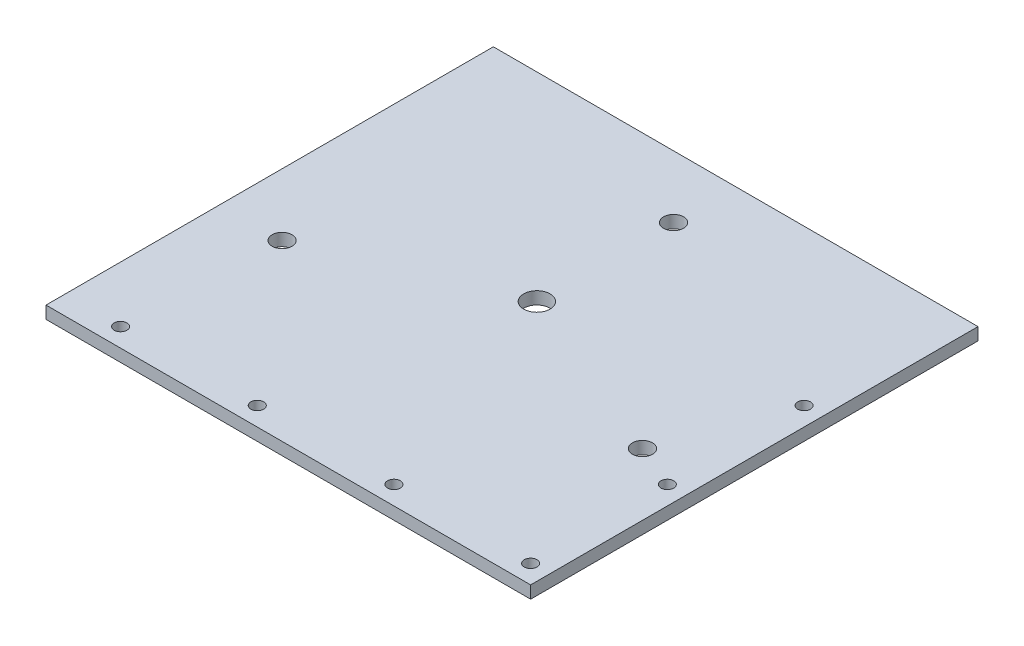
ISO-10303-21;
HEADER;
FILE_DESCRIPTION(('STEP AP214'),'2;1');
FILE_NAME('part.step','',(''),(''),'','','');
FILE_SCHEMA(('AUTOMOTIVE_DESIGN { 1 0 10303 214 1 1 1 1 }'));
ENDSEC;
DATA;
#1=APPLICATION_CONTEXT('core data for automotive mechanical design processes');
#2=APPLICATION_PROTOCOL_DEFINITION('international standard','automotive_design',2000,#1);
#3=PRODUCT_CONTEXT('',#1,'mechanical');
#4=PRODUCT('Part','Part','',(#3));
#5=PRODUCT_RELATED_PRODUCT_CATEGORY('part','',(#4));
#6=PRODUCT_DEFINITION_FORMATION('','',#4);
#7=PRODUCT_DEFINITION_CONTEXT('part definition',#1,'design');
#8=PRODUCT_DEFINITION('design','',#6,#7);
#9=PRODUCT_DEFINITION_SHAPE('','',#8);
#10=(LENGTH_UNIT() NAMED_UNIT(*) SI_UNIT(.MILLI.,.METRE.));
#11=(NAMED_UNIT(*) PLANE_ANGLE_UNIT() SI_UNIT($,.RADIAN.));
#12=(NAMED_UNIT(*) SI_UNIT($,.STERADIAN.) SOLID_ANGLE_UNIT());
#13=UNCERTAINTY_MEASURE_WITH_UNIT(LENGTH_MEASURE(1.E-05),#10,'distance_accuracy_value','');
#14=(GEOMETRIC_REPRESENTATION_CONTEXT(3) GLOBAL_UNCERTAINTY_ASSIGNED_CONTEXT((#13)) GLOBAL_UNIT_ASSIGNED_CONTEXT((#10,
#11,#12)) REPRESENTATION_CONTEXT('',''));
#15=CARTESIAN_POINT('',(0.,0.,0.));
#16=DIRECTION('',(0.,0.,1.));
#17=DIRECTION('',(1.,0.,0.));
#18=AXIS2_PLACEMENT_3D('',#15,#16,#17);
#19=CARTESIAN_POINT('',(0.,3.175,0.));
#20=DIRECTION('',(0.,-1.,0.));
#21=DIRECTION('',(0.,0.,-1.));
#22=AXIS2_PLACEMENT_3D('',#19,#20,#21);
#23=PLANE('',#22);
#24=CARTESIAN_POINT('',(-46.0375,3.175,12.7));
#25=DIRECTION('',(0.,1.,0.));
#26=DIRECTION('',(0.,0.,1.));
#27=AXIS2_PLACEMENT_3D('',#24,#25,#26);
#28=CIRCLE('',#27,2.55269999999999);
#29=CARTESIAN_POINT('',(-46.0375,3.175,15.2527));
#30=VERTEX_POINT('',#29);
#31=EDGE_CURVE('E238',#30,#30,#28,.T.);
#32=ORIENTED_EDGE('',*,*,#31,.F.);
#33=EDGE_LOOP('',(#32));
#34=FACE_BOUND('',#33,.T.);
#35=CARTESIAN_POINT('',(57.15,3.175,52.3875));
#36=DIRECTION('',(0.,1.,0.));
#37=DIRECTION('',(0.,0.,1.));
#38=AXIS2_PLACEMENT_3D('',#35,#36,#37);
#39=CIRCLE('',#38,1.63195);
#40=CARTESIAN_POINT('',(57.15,3.175,54.01945));
#41=VERTEX_POINT('',#40);
#42=EDGE_CURVE('E253',#41,#41,#39,.T.);
#43=ORIENTED_EDGE('',*,*,#42,.F.);
#44=EDGE_LOOP('',(#43));
#45=FACE_BOUND('',#44,.T.);
#46=CARTESIAN_POINT('',(57.15,3.175,17.4625));
#47=DIRECTION('',(0.,1.,0.));
#48=DIRECTION('',(0.,0.,1.));
#49=AXIS2_PLACEMENT_3D('',#46,#47,#48);
#50=CIRCLE('',#49,1.63195);
#51=CARTESIAN_POINT('',(57.15,3.175,19.09445));
#52=VERTEX_POINT('',#51);
#53=EDGE_CURVE('E259',#52,#52,#50,.T.);
#54=ORIENTED_EDGE('',*,*,#53,.F.);
#55=EDGE_LOOP('',(#54));
#56=FACE_BOUND('',#55,.T.);
#57=CARTESIAN_POINT('',(57.15,3.175,-17.4625));
#58=DIRECTION('',(0.,1.,0.));
#59=DIRECTION('',(0.,0.,1.));
#60=AXIS2_PLACEMENT_3D('',#57,#58,#59);
#61=CIRCLE('',#60,1.63195);
#62=CARTESIAN_POINT('',(57.15,3.175,-15.83055));
#63=VERTEX_POINT('',#62);
#64=EDGE_CURVE('E265',#63,#63,#61,.T.);
#65=ORIENTED_EDGE('',*,*,#64,.F.);
#66=EDGE_LOOP('',(#65));
#67=FACE_BOUND('',#66,.T.);
#68=CARTESIAN_POINT('',(-12.7,3.175,52.3875));
#69=DIRECTION('',(0.,1.,0.));
#70=DIRECTION('',(0.,0.,1.));
#71=AXIS2_PLACEMENT_3D('',#68,#69,#70);
#72=CIRCLE('',#71,1.63195);
#73=CARTESIAN_POINT('',(-12.7,3.175,54.01945));
#74=VERTEX_POINT('',#73);
#75=EDGE_CURVE('E277',#74,#74,#72,.T.);
#76=ORIENTED_EDGE('',*,*,#75,.F.);
#77=EDGE_LOOP('',(#76));
#78=FACE_BOUND('',#77,.T.);
#79=CARTESIAN_POINT('',(-47.625,3.175,52.3875));
#80=DIRECTION('',(0.,1.,0.));
#81=DIRECTION('',(0.,0.,1.));
#82=AXIS2_PLACEMENT_3D('',#79,#80,#81);
#83=CIRCLE('',#82,1.63195);
#84=CARTESIAN_POINT('',(-47.625,3.175,54.01945));
#85=VERTEX_POINT('',#84);
#86=EDGE_CURVE('E283',#85,#85,#83,.T.);
#87=ORIENTED_EDGE('',*,*,#86,.F.);
#88=EDGE_LOOP('',(#87));
#89=FACE_BOUND('',#88,.T.);
#90=CARTESIAN_POINT('',(0.,3.175,-6.35));
#91=DIRECTION('',(0.,1.,0.));
#92=DIRECTION('',(0.,0.,1.));
#93=AXIS2_PLACEMENT_3D('',#90,#91,#92);
#94=CIRCLE('',#93,3.3782);
#95=CARTESIAN_POINT('',(0.,3.175,-2.9718));
#96=VERTEX_POINT('',#95);
#97=EDGE_CURVE('E289',#96,#96,#94,.T.);
#98=ORIENTED_EDGE('',*,*,#97,.F.);
#99=EDGE_LOOP('',(#98));
#100=FACE_BOUND('',#99,.T.);
#101=DIRECTION('',(0.,0.,-1.));
#102=VECTOR('',#101,1.);
#103=CARTESIAN_POINT('',(-61.9125,3.175,57.15));
#104=LINE('',#103,#102);
#105=CARTESIAN_POINT('',(-61.9125,3.175,57.15));
#106=VERTEX_POINT('',#105);
#107=CARTESIAN_POINT('',(-61.9125,3.175,-57.15));
#108=VERTEX_POINT('',#107);
#109=EDGE_CURVE('E94',#106,#108,#104,.T.);
#110=ORIENTED_EDGE('',*,*,#109,.F.);
#111=DIRECTION('',(1.,0.,0.));
#112=VECTOR('',#111,1.);
#113=CARTESIAN_POINT('',(-61.9125,3.175,57.15));
#114=LINE('',#113,#112);
#115=CARTESIAN_POINT('',(61.9125,3.175,57.15));
#116=VERTEX_POINT('',#115);
#117=EDGE_CURVE('E84',#106,#116,#114,.T.);
#118=ORIENTED_EDGE('',*,*,#117,.T.);
#119=DIRECTION('',(0.,0.,-1.));
#120=VECTOR('',#119,1.);
#121=CARTESIAN_POINT('',(61.9125,3.175,57.15));
#122=LINE('',#121,#120);
#123=CARTESIAN_POINT('',(61.9125,3.175,-57.15));
#124=VERTEX_POINT('',#123);
#125=EDGE_CURVE('E79',#116,#124,#122,.T.);
#126=ORIENTED_EDGE('',*,*,#125,.T.);
#127=DIRECTION('',(1.,0.,0.));
#128=VECTOR('',#127,1.);
#129=CARTESIAN_POINT('',(-61.9125,3.175,-57.15));
#130=LINE('',#129,#128);
#131=EDGE_CURVE('E83',#108,#124,#130,.T.);
#132=ORIENTED_EDGE('',*,*,#131,.F.);
#133=EDGE_LOOP('',(#110,#118,#126,#132));
#134=FACE_BOUND('',#133,.T.);
#135=CARTESIAN_POINT('',(22.225,3.175,52.3875));
#136=DIRECTION('',(0.,1.,0.));
#137=DIRECTION('',(0.,0.,1.));
#138=AXIS2_PLACEMENT_3D('',#135,#136,#137);
#139=CIRCLE('',#138,1.63195);
#140=CARTESIAN_POINT('',(22.225,3.175,54.01945));
#141=VERTEX_POINT('',#140);
#142=EDGE_CURVE('E271',#141,#141,#139,.T.);
#143=ORIENTED_EDGE('',*,*,#142,.F.);
#144=EDGE_LOOP('',(#143));
#145=FACE_BOUND('',#144,.T.);
#146=CARTESIAN_POINT('',(46.0375,3.175,12.7));
#147=DIRECTION('',(0.,1.,0.));
#148=DIRECTION('',(0.,0.,1.));
#149=AXIS2_PLACEMENT_3D('',#146,#147,#148);
#150=CIRCLE('',#149,2.55269999999999);
#151=CARTESIAN_POINT('',(46.0375,3.175,15.2527));
#152=VERTEX_POINT('',#151);
#153=EDGE_CURVE('E247',#152,#152,#150,.T.);
#154=ORIENTED_EDGE('',*,*,#153,.F.);
#155=EDGE_LOOP('',(#154));
#156=FACE_BOUND('',#155,.T.);
#157=CARTESIAN_POINT('',(0.,3.175,-41.275));
#158=DIRECTION('',(0.,1.,0.));
#159=DIRECTION('',(0.,0.,1.));
#160=AXIS2_PLACEMENT_3D('',#157,#158,#159);
#161=CIRCLE('',#160,2.55269999999999);
#162=CARTESIAN_POINT('',(0.,3.175,-38.7223));
#163=VERTEX_POINT('',#162);
#164=EDGE_CURVE('E234',#163,#163,#161,.T.);
#165=ORIENTED_EDGE('',*,*,#164,.F.);
#166=EDGE_LOOP('',(#165));
#167=FACE_BOUND('',#166,.T.);
#168=ADVANCED_FACE('F33',(#34,#45,#56,#67,#78,#89,#100,#134,#145,#156,#167),#23,.F.);
#169=CARTESIAN_POINT('',(-61.9125,3.175,57.15));
#170=DIRECTION('',(-1.,0.,0.));
#171=DIRECTION('',(0.,0.,1.));
#172=AXIS2_PLACEMENT_3D('',#169,#170,#171);
#173=PLANE('',#172);
#174=DIRECTION('',(0.,0.,-1.));
#175=VECTOR('',#174,1.);
#176=CARTESIAN_POINT('',(-61.9125,0.,57.15));
#177=LINE('',#176,#175);
#178=CARTESIAN_POINT('',(-61.9125,0.,57.15));
#179=VERTEX_POINT('',#178);
#180=CARTESIAN_POINT('',(-61.9125,0.,-57.15));
#181=VERTEX_POINT('',#180);
#182=EDGE_CURVE('E100',#179,#181,#177,.T.);
#183=ORIENTED_EDGE('',*,*,#182,.F.);
#184=DIRECTION('',(0.,-1.,0.));
#185=VECTOR('',#184,1.);
#186=CARTESIAN_POINT('',(-61.9125,3.175,57.15));
#187=LINE('',#186,#185);
#188=EDGE_CURVE('E11',#106,#179,#187,.T.);
#189=ORIENTED_EDGE('',*,*,#188,.F.);
#190=ORIENTED_EDGE('',*,*,#109,.T.);
#191=DIRECTION('',(0.,-1.,0.));
#192=VECTOR('',#191,1.);
#193=CARTESIAN_POINT('',(-61.9125,3.175,-57.15));
#194=LINE('',#193,#192);
#195=EDGE_CURVE('E37',#108,#181,#194,.T.);
#196=ORIENTED_EDGE('',*,*,#195,.T.);
#197=EDGE_LOOP('',(#183,#189,#190,#196));
#198=FACE_BOUND('',#197,.T.);
#199=ADVANCED_FACE('F35',(#198),#173,.T.);
#200=CARTESIAN_POINT('',(-61.9125,3.175,57.15));
#201=DIRECTION('',(0.,0.,-1.));
#202=DIRECTION('',(-1.,0.,0.));
#203=AXIS2_PLACEMENT_3D('',#200,#201,#202);
#204=PLANE('',#203);
#205=DIRECTION('',(1.,0.,0.));
#206=VECTOR('',#205,1.);
#207=CARTESIAN_POINT('',(-61.9125,0.,57.15));
#208=LINE('',#207,#206);
#209=CARTESIAN_POINT('',(61.9125,0.,57.15));
#210=VERTEX_POINT('',#209);
#211=EDGE_CURVE('E67',#179,#210,#208,.T.);
#212=ORIENTED_EDGE('',*,*,#211,.T.);
#213=DIRECTION('',(0.,-1.,0.));
#214=VECTOR('',#213,1.);
#215=CARTESIAN_POINT('',(61.9125,3.175,57.15));
#216=LINE('',#215,#214);
#217=EDGE_CURVE('E43',#116,#210,#216,.T.);
#218=ORIENTED_EDGE('',*,*,#217,.F.);
#219=ORIENTED_EDGE('',*,*,#117,.F.);
#220=ORIENTED_EDGE('',*,*,#188,.T.);
#221=EDGE_LOOP('',(#212,#218,#219,#220));
#222=FACE_BOUND('',#221,.T.);
#223=ADVANCED_FACE('F111',(#222),#204,.F.);
#224=CARTESIAN_POINT('',(61.9125,3.175,57.15));
#225=DIRECTION('',(-1.,0.,0.));
#226=DIRECTION('',(0.,0.,1.));
#227=AXIS2_PLACEMENT_3D('',#224,#225,#226);
#228=PLANE('',#227);
#229=DIRECTION('',(0.,0.,-1.));
#230=VECTOR('',#229,1.);
#231=CARTESIAN_POINT('',(61.9125,0.,57.15));
#232=LINE('',#231,#230);
#233=CARTESIAN_POINT('',(61.9125,0.,-57.15));
#234=VERTEX_POINT('',#233);
#235=EDGE_CURVE('E91',#210,#234,#232,.T.);
#236=ORIENTED_EDGE('',*,*,#235,.T.);
#237=DIRECTION('',(0.,-1.,0.));
#238=VECTOR('',#237,1.);
#239=CARTESIAN_POINT('',(61.9125,3.175,-57.15));
#240=LINE('',#239,#238);
#241=EDGE_CURVE('E88',#124,#234,#240,.T.);
#242=ORIENTED_EDGE('',*,*,#241,.F.);
#243=ORIENTED_EDGE('',*,*,#125,.F.);
#244=ORIENTED_EDGE('',*,*,#217,.T.);
#245=EDGE_LOOP('',(#236,#242,#243,#244));
#246=FACE_BOUND('',#245,.T.);
#247=ADVANCED_FACE('F89',(#246),#228,.F.);
#248=CARTESIAN_POINT('',(-61.9125,3.175,-57.15));
#249=DIRECTION('',(0.,0.,-1.));
#250=DIRECTION('',(-1.,0.,0.));
#251=AXIS2_PLACEMENT_3D('',#248,#249,#250);
#252=PLANE('',#251);
#253=DIRECTION('',(1.,0.,0.));
#254=VECTOR('',#253,1.);
#255=CARTESIAN_POINT('',(-61.9125,0.,-57.15));
#256=LINE('',#255,#254);
#257=EDGE_CURVE('E103',#181,#234,#256,.T.);
#258=ORIENTED_EDGE('',*,*,#257,.F.);
#259=ORIENTED_EDGE('',*,*,#195,.F.);
#260=ORIENTED_EDGE('',*,*,#131,.T.);
#261=ORIENTED_EDGE('',*,*,#241,.T.);
#262=EDGE_LOOP('',(#258,#259,#260,#261));
#263=FACE_BOUND('',#262,.T.);
#264=ADVANCED_FACE('F93',(#263),#252,.T.);
#265=CARTESIAN_POINT('',(0.,0.,0.));
#266=DIRECTION('',(0.,-1.,0.));
#267=DIRECTION('',(0.,0.,-1.));
#268=AXIS2_PLACEMENT_3D('',#265,#266,#267);
#269=PLANE('',#268);
#270=CARTESIAN_POINT('',(0.,0.,-41.275));
#271=DIRECTION('',(0.,-1.,0.));
#272=DIRECTION('',(0.,0.,-1.));
#273=AXIS2_PLACEMENT_3D('',#270,#271,#272);
#274=CIRCLE('',#273,2.55269999999999);
#275=CARTESIAN_POINT('',(0.,0.,-43.8277));
#276=VERTEX_POINT('',#275);
#277=EDGE_CURVE('E237',#276,#276,#274,.T.);
#278=ORIENTED_EDGE('',*,*,#277,.F.);
#279=EDGE_LOOP('',(#278));
#280=FACE_BOUND('',#279,.T.);
#281=CARTESIAN_POINT('',(-46.0375,0.,12.7));
#282=DIRECTION('',(0.,-1.,0.));
#283=DIRECTION('',(0.,0.,-1.));
#284=AXIS2_PLACEMENT_3D('',#281,#282,#283);
#285=CIRCLE('',#284,2.55269999999999);
#286=CARTESIAN_POINT('',(-46.0375,0.,10.1473));
#287=VERTEX_POINT('',#286);
#288=EDGE_CURVE('E241',#287,#287,#285,.T.);
#289=ORIENTED_EDGE('',*,*,#288,.F.);
#290=EDGE_LOOP('',(#289));
#291=FACE_BOUND('',#290,.T.);
#292=CARTESIAN_POINT('',(46.0375,0.,12.7));
#293=DIRECTION('',(0.,-1.,0.));
#294=DIRECTION('',(0.,0.,-1.));
#295=AXIS2_PLACEMENT_3D('',#292,#293,#294);
#296=CIRCLE('',#295,2.55269999999999);
#297=CARTESIAN_POINT('',(46.0375,0.,10.1473));
#298=VERTEX_POINT('',#297);
#299=EDGE_CURVE('E250',#298,#298,#296,.T.);
#300=ORIENTED_EDGE('',*,*,#299,.F.);
#301=EDGE_LOOP('',(#300));
#302=FACE_BOUND('',#301,.T.);
#303=CARTESIAN_POINT('',(57.15,0.,52.3875));
#304=DIRECTION('',(0.,-1.,0.));
#305=DIRECTION('',(0.,0.,-1.));
#306=AXIS2_PLACEMENT_3D('',#303,#304,#305);
#307=CIRCLE('',#306,1.63195);
#308=CARTESIAN_POINT('',(57.15,0.,50.75555));
#309=VERTEX_POINT('',#308);
#310=EDGE_CURVE('E256',#309,#309,#307,.T.);
#311=ORIENTED_EDGE('',*,*,#310,.F.);
#312=EDGE_LOOP('',(#311));
#313=FACE_BOUND('',#312,.T.);
#314=CARTESIAN_POINT('',(57.15,0.,17.4625));
#315=DIRECTION('',(0.,-1.,0.));
#316=DIRECTION('',(0.,0.,-1.));
#317=AXIS2_PLACEMENT_3D('',#314,#315,#316);
#318=CIRCLE('',#317,1.63195);
#319=CARTESIAN_POINT('',(57.15,0.,15.83055));
#320=VERTEX_POINT('',#319);
#321=EDGE_CURVE('E262',#320,#320,#318,.T.);
#322=ORIENTED_EDGE('',*,*,#321,.F.);
#323=EDGE_LOOP('',(#322));
#324=FACE_BOUND('',#323,.T.);
#325=CARTESIAN_POINT('',(57.15,0.,-17.4625));
#326=DIRECTION('',(0.,-1.,0.));
#327=DIRECTION('',(0.,0.,-1.));
#328=AXIS2_PLACEMENT_3D('',#325,#326,#327);
#329=CIRCLE('',#328,1.63195);
#330=CARTESIAN_POINT('',(57.15,0.,-19.09445));
#331=VERTEX_POINT('',#330);
#332=EDGE_CURVE('E268',#331,#331,#329,.T.);
#333=ORIENTED_EDGE('',*,*,#332,.F.);
#334=EDGE_LOOP('',(#333));
#335=FACE_BOUND('',#334,.T.);
#336=CARTESIAN_POINT('',(22.225,0.,52.3875));
#337=DIRECTION('',(0.,-1.,0.));
#338=DIRECTION('',(0.,0.,-1.));
#339=AXIS2_PLACEMENT_3D('',#336,#337,#338);
#340=CIRCLE('',#339,1.63195);
#341=CARTESIAN_POINT('',(22.225,0.,50.75555));
#342=VERTEX_POINT('',#341);
#343=EDGE_CURVE('E274',#342,#342,#340,.T.);
#344=ORIENTED_EDGE('',*,*,#343,.F.);
#345=EDGE_LOOP('',(#344));
#346=FACE_BOUND('',#345,.T.);
#347=CARTESIAN_POINT('',(-12.7,0.,52.3875));
#348=DIRECTION('',(0.,-1.,0.));
#349=DIRECTION('',(0.,0.,-1.));
#350=AXIS2_PLACEMENT_3D('',#347,#348,#349);
#351=CIRCLE('',#350,1.63195);
#352=CARTESIAN_POINT('',(-12.7,0.,50.75555));
#353=VERTEX_POINT('',#352);
#354=EDGE_CURVE('E280',#353,#353,#351,.T.);
#355=ORIENTED_EDGE('',*,*,#354,.F.);
#356=EDGE_LOOP('',(#355));
#357=FACE_BOUND('',#356,.T.);
#358=CARTESIAN_POINT('',(-47.625,0.,52.3875));
#359=DIRECTION('',(0.,-1.,0.));
#360=DIRECTION('',(0.,0.,-1.));
#361=AXIS2_PLACEMENT_3D('',#358,#359,#360);
#362=CIRCLE('',#361,1.63195);
#363=CARTESIAN_POINT('',(-47.625,0.,50.75555));
#364=VERTEX_POINT('',#363);
#365=EDGE_CURVE('E286',#364,#364,#362,.T.);
#366=ORIENTED_EDGE('',*,*,#365,.F.);
#367=EDGE_LOOP('',(#366));
#368=FACE_BOUND('',#367,.T.);
#369=CARTESIAN_POINT('',(0.,0.,-6.35));
#370=DIRECTION('',(0.,-1.,0.));
#371=DIRECTION('',(0.,0.,-1.));
#372=AXIS2_PLACEMENT_3D('',#369,#370,#371);
#373=CIRCLE('',#372,3.3782);
#374=CARTESIAN_POINT('',(0.,0.,-9.7282));
#375=VERTEX_POINT('',#374);
#376=EDGE_CURVE('E104',#375,#375,#373,.T.);
#377=ORIENTED_EDGE('',*,*,#376,.F.);
#378=EDGE_LOOP('',(#377));
#379=FACE_BOUND('',#378,.T.);
#380=ORIENTED_EDGE('',*,*,#182,.T.);
#381=ORIENTED_EDGE('',*,*,#257,.T.);
#382=ORIENTED_EDGE('',*,*,#235,.F.);
#383=ORIENTED_EDGE('',*,*,#211,.F.);
#384=EDGE_LOOP('',(#380,#381,#382,#383));
#385=FACE_BOUND('',#384,.T.);
#386=ADVANCED_FACE('F109',(#280,#291,#302,#313,#324,#335,#346,#357,#368,#379,#385),#269,.T.);
#387=CARTESIAN_POINT('',(0.,3.175,-6.35));
#388=DIRECTION('',(0.,1.,0.));
#389=DIRECTION('',(0.,0.,1.));
#390=AXIS2_PLACEMENT_3D('',#387,#388,#389);
#391=CYLINDRICAL_SURFACE('',#390,3.3782);
#392=ORIENTED_EDGE('',*,*,#97,.T.);
#393=EDGE_LOOP('',(#392));
#394=FACE_BOUND('',#393,.T.);
#395=ORIENTED_EDGE('',*,*,#376,.T.);
#396=EDGE_LOOP('',(#395));
#397=FACE_BOUND('',#396,.T.);
#398=ADVANCED_FACE('F127',(#394,#397),#391,.F.);
#399=CARTESIAN_POINT('',(-47.625,3.175,52.3875));
#400=DIRECTION('',(0.,1.,0.));
#401=DIRECTION('',(0.,0.,1.));
#402=AXIS2_PLACEMENT_3D('',#399,#400,#401);
#403=CYLINDRICAL_SURFACE('',#402,1.63195);
#404=ORIENTED_EDGE('',*,*,#86,.T.);
#405=EDGE_LOOP('',(#404));
#406=FACE_BOUND('',#405,.T.);
#407=ORIENTED_EDGE('',*,*,#365,.T.);
#408=EDGE_LOOP('',(#407));
#409=FACE_BOUND('',#408,.T.);
#410=ADVANCED_FACE('F151',(#406,#409),#403,.F.);
#411=CARTESIAN_POINT('',(-12.7,3.175,52.3875));
#412=DIRECTION('',(0.,1.,0.));
#413=DIRECTION('',(0.,0.,1.));
#414=AXIS2_PLACEMENT_3D('',#411,#412,#413);
#415=CYLINDRICAL_SURFACE('',#414,1.63195);
#416=ORIENTED_EDGE('',*,*,#75,.T.);
#417=EDGE_LOOP('',(#416));
#418=FACE_BOUND('',#417,.T.);
#419=ORIENTED_EDGE('',*,*,#354,.T.);
#420=EDGE_LOOP('',(#419));
#421=FACE_BOUND('',#420,.T.);
#422=ADVANCED_FACE('F157',(#418,#421),#415,.F.);
#423=CARTESIAN_POINT('',(22.225,3.175,52.3875));
#424=DIRECTION('',(0.,1.,0.));
#425=DIRECTION('',(0.,0.,1.));
#426=AXIS2_PLACEMENT_3D('',#423,#424,#425);
#427=CYLINDRICAL_SURFACE('',#426,1.63195);
#428=ORIENTED_EDGE('',*,*,#142,.T.);
#429=EDGE_LOOP('',(#428));
#430=FACE_BOUND('',#429,.T.);
#431=ORIENTED_EDGE('',*,*,#343,.T.);
#432=EDGE_LOOP('',(#431));
#433=FACE_BOUND('',#432,.T.);
#434=ADVANCED_FACE('F164',(#430,#433),#427,.F.);
#435=CARTESIAN_POINT('',(57.15,3.175,-17.4625));
#436=DIRECTION('',(0.,1.,0.));
#437=DIRECTION('',(0.,0.,1.));
#438=AXIS2_PLACEMENT_3D('',#435,#436,#437);
#439=CYLINDRICAL_SURFACE('',#438,1.63195);
#440=ORIENTED_EDGE('',*,*,#64,.T.);
#441=EDGE_LOOP('',(#440));
#442=FACE_BOUND('',#441,.T.);
#443=ORIENTED_EDGE('',*,*,#332,.T.);
#444=EDGE_LOOP('',(#443));
#445=FACE_BOUND('',#444,.T.);
#446=ADVANCED_FACE('F172',(#442,#445),#439,.F.);
#447=CARTESIAN_POINT('',(57.15,3.175,17.4625));
#448=DIRECTION('',(0.,1.,0.));
#449=DIRECTION('',(0.,0.,1.));
#450=AXIS2_PLACEMENT_3D('',#447,#448,#449);
#451=CYLINDRICAL_SURFACE('',#450,1.63195);
#452=ORIENTED_EDGE('',*,*,#53,.T.);
#453=EDGE_LOOP('',(#452));
#454=FACE_BOUND('',#453,.T.);
#455=ORIENTED_EDGE('',*,*,#321,.T.);
#456=EDGE_LOOP('',(#455));
#457=FACE_BOUND('',#456,.T.);
#458=ADVANCED_FACE('F180',(#454,#457),#451,.F.);
#459=CARTESIAN_POINT('',(57.15,3.175,52.3875));
#460=DIRECTION('',(0.,1.,0.));
#461=DIRECTION('',(0.,0.,1.));
#462=AXIS2_PLACEMENT_3D('',#459,#460,#461);
#463=CYLINDRICAL_SURFACE('',#462,1.63195);
#464=ORIENTED_EDGE('',*,*,#42,.T.);
#465=EDGE_LOOP('',(#464));
#466=FACE_BOUND('',#465,.T.);
#467=ORIENTED_EDGE('',*,*,#310,.T.);
#468=EDGE_LOOP('',(#467));
#469=FACE_BOUND('',#468,.T.);
#470=ADVANCED_FACE('F188',(#466,#469),#463,.F.);
#471=CARTESIAN_POINT('',(46.0375,3.175,12.7));
#472=DIRECTION('',(0.,1.,0.));
#473=DIRECTION('',(0.,0.,1.));
#474=AXIS2_PLACEMENT_3D('',#471,#472,#473);
#475=CYLINDRICAL_SURFACE('',#474,2.55269999999999);
#476=ORIENTED_EDGE('',*,*,#153,.T.);
#477=EDGE_LOOP('',(#476));
#478=FACE_BOUND('',#477,.T.);
#479=ORIENTED_EDGE('',*,*,#299,.T.);
#480=EDGE_LOOP('',(#479));
#481=FACE_BOUND('',#480,.T.);
#482=ADVANCED_FACE('F195',(#478,#481),#475,.F.);
#483=CARTESIAN_POINT('',(-46.0375,3.175,12.7));
#484=DIRECTION('',(0.,1.,0.));
#485=DIRECTION('',(0.,0.,1.));
#486=AXIS2_PLACEMENT_3D('',#483,#484,#485);
#487=CYLINDRICAL_SURFACE('',#486,2.55269999999999);
#488=ORIENTED_EDGE('',*,*,#31,.T.);
#489=EDGE_LOOP('',(#488));
#490=FACE_BOUND('',#489,.T.);
#491=ORIENTED_EDGE('',*,*,#288,.T.);
#492=EDGE_LOOP('',(#491));
#493=FACE_BOUND('',#492,.T.);
#494=ADVANCED_FACE('F207',(#490,#493),#487,.F.);
#495=CARTESIAN_POINT('',(0.,3.175,-41.275));
#496=DIRECTION('',(0.,1.,0.));
#497=DIRECTION('',(0.,0.,1.));
#498=AXIS2_PLACEMENT_3D('',#495,#496,#497);
#499=CYLINDRICAL_SURFACE('',#498,2.55269999999999);
#500=ORIENTED_EDGE('',*,*,#164,.T.);
#501=EDGE_LOOP('',(#500));
#502=FACE_BOUND('',#501,.T.);
#503=ORIENTED_EDGE('',*,*,#277,.T.);
#504=EDGE_LOOP('',(#503));
#505=FACE_BOUND('',#504,.T.);
#506=ADVANCED_FACE('F214',(#502,#505),#499,.F.);
#507=CLOSED_SHELL('',(#168,#199,#223,#247,#264,#386,#398,#410,#422,#434,#446,#458,#470,#482,
#494,#506));
#508=MANIFOLD_SOLID_BREP('B2',#507);
#509=ADVANCED_BREP_SHAPE_REPRESENTATION('',(#18,#508),#14);
#510=SHAPE_DEFINITION_REPRESENTATION(#9,#509);
ENDSEC;
END-ISO-10303-21;
